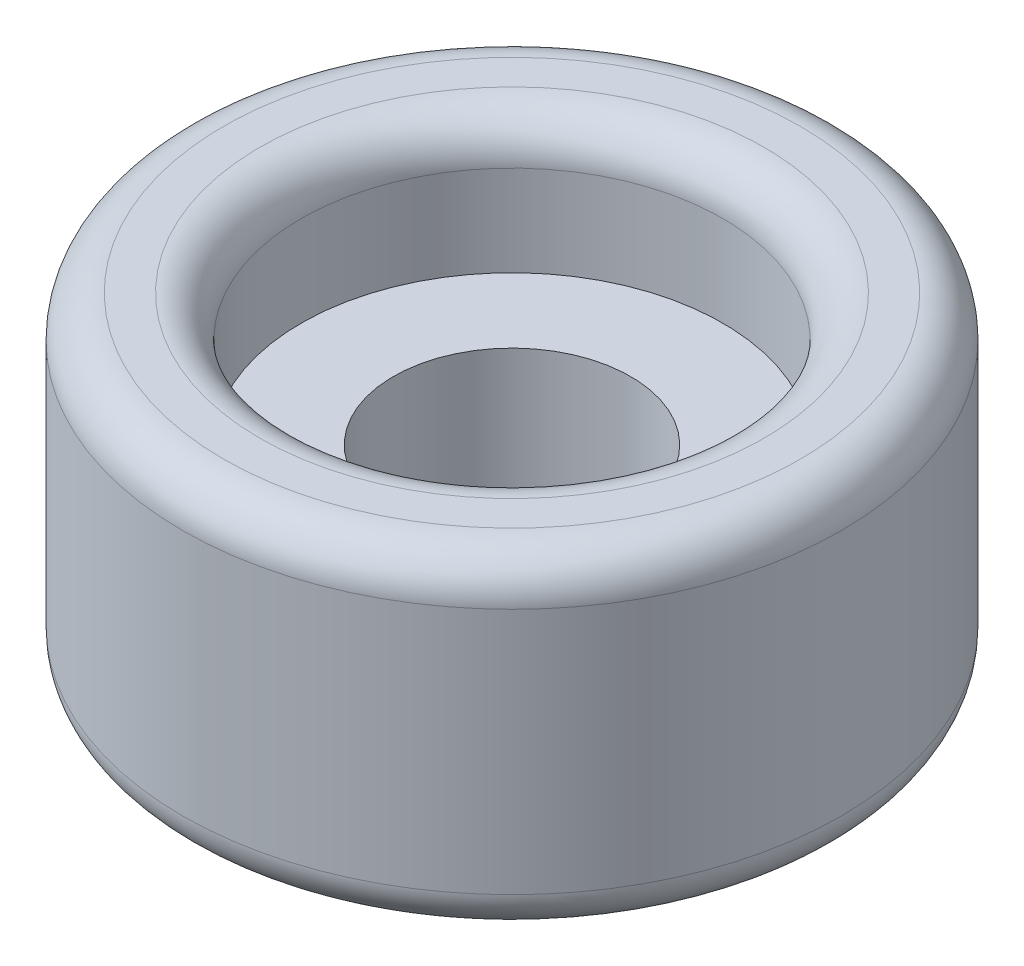
ISO-10303-21;
HEADER;
FILE_DESCRIPTION(('STEP AP214'),'2;1');
FILE_NAME('part.step','',(''),(''),'','','');
FILE_SCHEMA(('AUTOMOTIVE_DESIGN { 1 0 10303 214 1 1 1 1 }'));
ENDSEC;
DATA;
#1=APPLICATION_CONTEXT('core data for automotive mechanical design processes');
#2=APPLICATION_PROTOCOL_DEFINITION('international standard','automotive_design',2000,#1);
#3=PRODUCT_CONTEXT('',#1,'mechanical');
#4=PRODUCT('Part','Part','',(#3));
#5=PRODUCT_RELATED_PRODUCT_CATEGORY('part','',(#4));
#6=PRODUCT_DEFINITION_FORMATION('','',#4);
#7=PRODUCT_DEFINITION_CONTEXT('part definition',#1,'design');
#8=PRODUCT_DEFINITION('design','',#6,#7);
#9=PRODUCT_DEFINITION_SHAPE('','',#8);
#10=(LENGTH_UNIT() NAMED_UNIT(*) SI_UNIT(.MILLI.,.METRE.));
#11=(NAMED_UNIT(*) PLANE_ANGLE_UNIT() SI_UNIT($,.RADIAN.));
#12=(NAMED_UNIT(*) SI_UNIT($,.STERADIAN.) SOLID_ANGLE_UNIT());
#13=UNCERTAINTY_MEASURE_WITH_UNIT(LENGTH_MEASURE(1.E-05),#10,'distance_accuracy_value','');
#14=(GEOMETRIC_REPRESENTATION_CONTEXT(3) GLOBAL_UNCERTAINTY_ASSIGNED_CONTEXT((#13)) GLOBAL_UNIT_ASSIGNED_CONTEXT((#10,
#11,#12)) REPRESENTATION_CONTEXT('',''));
#15=CARTESIAN_POINT('',(0.,0.,0.));
#16=DIRECTION('',(0.,0.,1.));
#17=DIRECTION('',(1.,0.,0.));
#18=AXIS2_PLACEMENT_3D('',#15,#16,#17);
#19=CARTESIAN_POINT('',(0.,0.,0.));
#20=DIRECTION('',(0.,1.,0.));
#21=DIRECTION('',(0.,0.,1.));
#22=AXIS2_PLACEMENT_3D('',#19,#20,#21);
#23=CYLINDRICAL_SURFACE('',#22,2.286);
#24=CARTESIAN_POINT('',(0.,0.,0.));
#25=DIRECTION('',(0.,1.,0.));
#26=DIRECTION('',(0.,0.,1.));
#27=AXIS2_PLACEMENT_3D('',#24,#25,#26);
#28=CIRCLE('',#27,2.286);
#29=CARTESIAN_POINT('',(0.,0.,2.286));
#30=VERTEX_POINT('',#29);
#31=EDGE_CURVE('E74',#30,#30,#28,.T.);
#32=ORIENTED_EDGE('',*,*,#31,.F.);
#33=EDGE_LOOP('',(#32));
#34=FACE_BOUND('',#33,.T.);
#35=CARTESIAN_POINT('',(0.,3.81,0.));
#36=DIRECTION('',(0.,1.,0.));
#37=DIRECTION('',(0.,0.,1.));
#38=AXIS2_PLACEMENT_3D('',#35,#36,#37);
#39=CIRCLE('',#38,2.286);
#40=CARTESIAN_POINT('',(0.,3.81,2.286));
#41=VERTEX_POINT('',#40);
#42=EDGE_CURVE('E75',#41,#41,#39,.F.);
#43=ORIENTED_EDGE('',*,*,#42,.F.);
#44=EDGE_LOOP('',(#43));
#45=FACE_BOUND('',#44,.T.);
#46=ADVANCED_FACE('F42',(#34,#45),#23,.F.);
#47=CARTESIAN_POINT('',(0.,6.35,0.));
#48=DIRECTION('',(0.,-1.,0.));
#49=DIRECTION('',(0.,0.,-1.));
#50=AXIS2_PLACEMENT_3D('',#47,#48,#49);
#51=CYLINDRICAL_SURFACE('',#50,6.35);
#52=CARTESIAN_POINT('',(0.,5.55625,0.));
#53=DIRECTION('',(0.,1.,0.));
#54=DIRECTION('',(0.,0.,1.));
#55=AXIS2_PLACEMENT_3D('',#52,#53,#54);
#56=CIRCLE('',#55,6.35);
#57=CARTESIAN_POINT('',(0.,5.55625,6.35));
#58=VERTEX_POINT('',#57);
#59=EDGE_CURVE('E55',#58,#58,#56,.F.);
#60=ORIENTED_EDGE('',*,*,#59,.T.);
#61=EDGE_LOOP('',(#60));
#62=FACE_BOUND('',#61,.T.);
#63=CARTESIAN_POINT('',(0.,0.79375,0.));
#64=DIRECTION('',(0.,1.,0.));
#65=DIRECTION('',(0.,0.,1.));
#66=AXIS2_PLACEMENT_3D('',#63,#64,#65);
#67=CIRCLE('',#66,6.35);
#68=CARTESIAN_POINT('',(0.,0.79375,6.35));
#69=VERTEX_POINT('',#68);
#70=EDGE_CURVE('E60',#69,#69,#67,.T.);
#71=ORIENTED_EDGE('',*,*,#70,.T.);
#72=EDGE_LOOP('',(#71));
#73=FACE_BOUND('',#72,.T.);
#74=ADVANCED_FACE('F106',(#62,#73),#51,.T.);
#75=CARTESIAN_POINT('',(0.,6.35,0.));
#76=DIRECTION('',(0.,1.,0.));
#77=DIRECTION('',(0.,0.,1.));
#78=AXIS2_PLACEMENT_3D('',#75,#76,#77);
#79=PLANE('',#78);
#80=CARTESIAN_POINT('',(0.,6.35,0.));
#81=DIRECTION('',(0.,1.,0.));
#82=DIRECTION('',(0.,0.,1.));
#83=AXIS2_PLACEMENT_3D('',#80,#81,#82);
#84=CIRCLE('',#83,5.55625);
#85=CARTESIAN_POINT('',(0.,6.35,5.55625));
#86=VERTEX_POINT('',#85);
#87=EDGE_CURVE('E66',#86,#86,#84,.T.);
#88=ORIENTED_EDGE('',*,*,#87,.T.);
#89=EDGE_LOOP('',(#88));
#90=FACE_BOUND('',#89,.T.);
#91=CARTESIAN_POINT('',(0.,6.35,0.));
#92=DIRECTION('',(0.,1.,0.));
#93=DIRECTION('',(0.,0.,1.));
#94=AXIS2_PLACEMENT_3D('',#91,#92,#93);
#95=CIRCLE('',#94,4.85775);
#96=CARTESIAN_POINT('',(0.,6.35,4.85775));
#97=VERTEX_POINT('',#96);
#98=EDGE_CURVE('E70',#97,#97,#95,.F.);
#99=ORIENTED_EDGE('',*,*,#98,.T.);
#100=EDGE_LOOP('',(#99));
#101=FACE_BOUND('',#100,.T.);
#102=ADVANCED_FACE('F111',(#90,#101),#79,.T.);
#103=CARTESIAN_POINT('',(0.,0.,0.));
#104=DIRECTION('',(0.,1.,0.));
#105=DIRECTION('',(0.,0.,1.));
#106=AXIS2_PLACEMENT_3D('',#103,#104,#105);
#107=PLANE('',#106);
#108=CARTESIAN_POINT('',(0.,0.,0.));
#109=DIRECTION('',(0.,1.,0.));
#110=DIRECTION('',(0.,0.,1.));
#111=AXIS2_PLACEMENT_3D('',#108,#109,#110);
#112=CIRCLE('',#111,5.55625);
#113=CARTESIAN_POINT('',(0.,0.,5.55625));
#114=VERTEX_POINT('',#113);
#115=EDGE_CURVE('E10',#114,#114,#112,.F.);
#116=ORIENTED_EDGE('',*,*,#115,.T.);
#117=EDGE_LOOP('',(#116));
#118=FACE_BOUND('',#117,.T.);
#119=ORIENTED_EDGE('',*,*,#31,.T.);
#120=EDGE_LOOP('',(#119));
#121=FACE_BOUND('',#120,.T.);
#122=ADVANCED_FACE('F102',(#118,#121),#107,.F.);
#123=CARTESIAN_POINT('',(0.,3.81,0.));
#124=DIRECTION('',(0.,1.,0.));
#125=DIRECTION('',(0.,0.,1.));
#126=AXIS2_PLACEMENT_3D('',#123,#124,#125);
#127=PLANE('',#126);
#128=CARTESIAN_POINT('',(0.,3.81,0.));
#129=DIRECTION('',(0.,1.,0.));
#130=DIRECTION('',(0.,0.,1.));
#131=AXIS2_PLACEMENT_3D('',#128,#129,#130);
#132=CIRCLE('',#131,4.064);
#133=CARTESIAN_POINT('',(0.,3.81,4.064));
#134=VERTEX_POINT('',#133);
#135=EDGE_CURVE('E79',#134,#134,#132,.T.);
#136=ORIENTED_EDGE('',*,*,#135,.T.);
#137=EDGE_LOOP('',(#136));
#138=FACE_BOUND('',#137,.T.);
#139=ORIENTED_EDGE('',*,*,#42,.T.);
#140=EDGE_LOOP('',(#139));
#141=FACE_BOUND('',#140,.T.);
#142=ADVANCED_FACE('F87',(#138,#141),#127,.T.);
#143=CARTESIAN_POINT('',(0.,3.81,0.));
#144=DIRECTION('',(0.,1.,0.));
#145=DIRECTION('',(0.,0.,1.));
#146=AXIS2_PLACEMENT_3D('',#143,#144,#145);
#147=CYLINDRICAL_SURFACE('',#146,4.064);
#148=CARTESIAN_POINT('',(0.,5.55625,0.));
#149=DIRECTION('',(0.,1.,0.));
#150=DIRECTION('',(0.,0.,1.));
#151=AXIS2_PLACEMENT_3D('',#148,#149,#150);
#152=CIRCLE('',#151,4.064);
#153=CARTESIAN_POINT('',(0.,5.55625,4.064));
#154=VERTEX_POINT('',#153);
#155=EDGE_CURVE('E50',#154,#154,#152,.T.);
#156=ORIENTED_EDGE('',*,*,#155,.T.);
#157=EDGE_LOOP('',(#156));
#158=FACE_BOUND('',#157,.T.);
#159=ORIENTED_EDGE('',*,*,#135,.F.);
#160=EDGE_LOOP('',(#159));
#161=FACE_BOUND('',#160,.T.);
#162=ADVANCED_FACE('F90',(#158,#161),#147,.F.);
#163=CARTESIAN_POINT('',(0.,5.55625,0.));
#164=DIRECTION('',(0.,1.,0.));
#165=DIRECTION('',(0.,0.,1.));
#166=AXIS2_PLACEMENT_3D('',#163,#164,#165);
#167=TOROIDAL_SURFACE('',#166,5.55625,0.79375);
#168=ORIENTED_EDGE('',*,*,#59,.F.);
#169=EDGE_LOOP('',(#168));
#170=FACE_BOUND('',#169,.T.);
#171=ORIENTED_EDGE('',*,*,#87,.F.);
#172=EDGE_LOOP('',(#171));
#173=FACE_BOUND('',#172,.T.);
#174=ADVANCED_FACE('F92',(#170,#173),#167,.T.);
#175=CARTESIAN_POINT('',(0.,5.55625,0.));
#176=DIRECTION('',(0.,1.,0.));
#177=DIRECTION('',(0.,0.,1.));
#178=AXIS2_PLACEMENT_3D('',#175,#176,#177);
#179=TOROIDAL_SURFACE('',#178,4.85775,0.79375);
#180=ORIENTED_EDGE('',*,*,#98,.F.);
#181=EDGE_LOOP('',(#180));
#182=FACE_BOUND('',#181,.T.);
#183=ORIENTED_EDGE('',*,*,#155,.F.);
#184=EDGE_LOOP('',(#183));
#185=FACE_BOUND('',#184,.T.);
#186=ADVANCED_FACE('F98',(#182,#185),#179,.T.);
#187=CARTESIAN_POINT('',(0.,0.79375,0.));
#188=DIRECTION('',(0.,1.,0.));
#189=DIRECTION('',(0.,0.,1.));
#190=AXIS2_PLACEMENT_3D('',#187,#188,#189);
#191=TOROIDAL_SURFACE('',#190,5.55625,0.79375);
#192=ORIENTED_EDGE('',*,*,#115,.F.);
#193=EDGE_LOOP('',(#192));
#194=FACE_BOUND('',#193,.T.);
#195=ORIENTED_EDGE('',*,*,#70,.F.);
#196=EDGE_LOOP('',(#195));
#197=FACE_BOUND('',#196,.T.);
#198=ADVANCED_FACE('F44',(#194,#197),#191,.T.);
#199=CLOSED_SHELL('',(#46,#74,#102,#122,#142,#162,#174,#186,#198));
#200=MANIFOLD_SOLID_BREP('B2',#199);
#201=ADVANCED_BREP_SHAPE_REPRESENTATION('',(#18,#200),#14);
#202=SHAPE_DEFINITION_REPRESENTATION(#9,#201);
ENDSEC;
END-ISO-10303-21;
